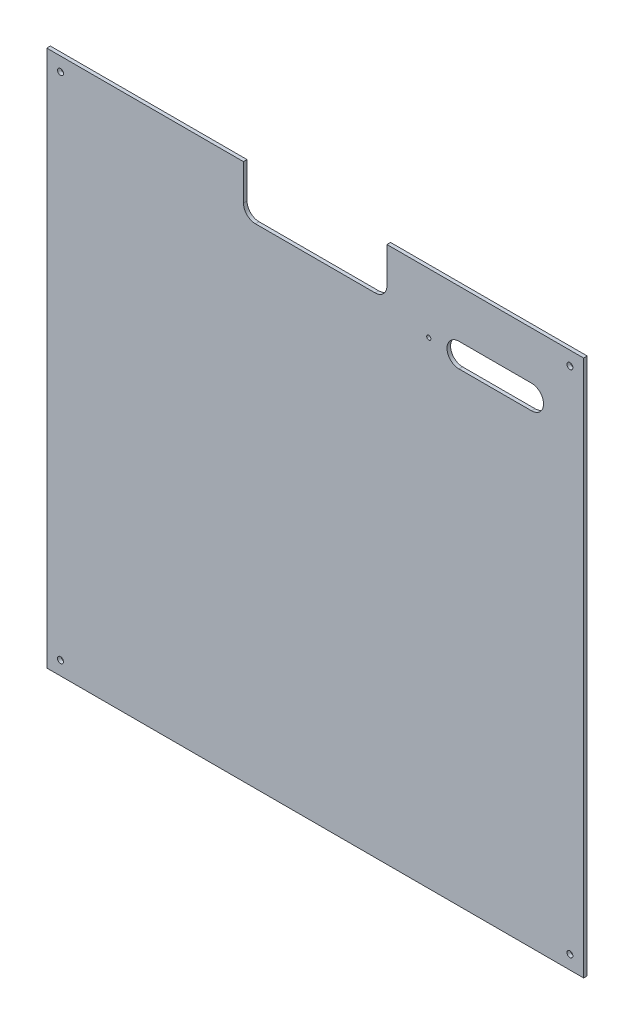
ISO-10303-21;
HEADER;
FILE_DESCRIPTION(('STEP AP214'),'2;1');
FILE_NAME('part.step','',(''),(''),'','','');
FILE_SCHEMA(('AUTOMOTIVE_DESIGN { 1 0 10303 214 1 1 1 1 }'));
ENDSEC;
DATA;
#1=APPLICATION_CONTEXT('core data for automotive mechanical design processes');
#2=APPLICATION_PROTOCOL_DEFINITION('international standard','automotive_design',2000,#1);
#3=PRODUCT_CONTEXT('',#1,'mechanical');
#4=PRODUCT('Part','Part','',(#3));
#5=PRODUCT_RELATED_PRODUCT_CATEGORY('part','',(#4));
#6=PRODUCT_DEFINITION_FORMATION('','',#4);
#7=PRODUCT_DEFINITION_CONTEXT('part definition',#1,'design');
#8=PRODUCT_DEFINITION('design','',#6,#7);
#9=PRODUCT_DEFINITION_SHAPE('','',#8);
#10=(LENGTH_UNIT() NAMED_UNIT(*) SI_UNIT(.MILLI.,.METRE.));
#11=(NAMED_UNIT(*) PLANE_ANGLE_UNIT() SI_UNIT($,.RADIAN.));
#12=(NAMED_UNIT(*) SI_UNIT($,.STERADIAN.) SOLID_ANGLE_UNIT());
#13=UNCERTAINTY_MEASURE_WITH_UNIT(LENGTH_MEASURE(1.E-05),#10,'distance_accuracy_value','');
#14=(GEOMETRIC_REPRESENTATION_CONTEXT(3) GLOBAL_UNCERTAINTY_ASSIGNED_CONTEXT((#13)) GLOBAL_UNIT_ASSIGNED_CONTEXT((#10,
#11,#12)) REPRESENTATION_CONTEXT('',''));
#15=CARTESIAN_POINT('',(0.,0.,0.));
#16=DIRECTION('',(0.,0.,1.));
#17=DIRECTION('',(1.,0.,0.));
#18=AXIS2_PLACEMENT_3D('',#15,#16,#17);
#19=CARTESIAN_POINT('',(174.5,419.,3.));
#20=DIRECTION('',(0.,0.,1.));
#21=DIRECTION('',(1.,0.,0.));
#22=AXIS2_PLACEMENT_3D('',#19,#20,#21);
#23=PLANE('',#22);
#24=DIRECTION('',(1.,0.,0.));
#25=VECTOR('',#24,1.);
#26=CARTESIAN_POINT('',(344.715899344631,389.,3.));
#27=LINE('',#26,#25);
#28=CARTESIAN_POINT('',(344.715899344631,389.,3.));
#29=VERTEX_POINT('',#28);
#30=CARTESIAN_POINT('',(405.440355678252,389.,3.));
#31=VERTEX_POINT('',#30);
#32=EDGE_CURVE('E144',#29,#31,#27,.T.);
#33=ORIENTED_EDGE('',*,*,#32,.F.);
#34=CARTESIAN_POINT('',(344.715899344631,399.,3.));
#35=DIRECTION('',(0.,0.,1.));
#36=DIRECTION('',(1.,0.,0.));
#37=AXIS2_PLACEMENT_3D('',#34,#35,#36);
#38=CIRCLE('',#37,10.);
#39=CARTESIAN_POINT('',(344.715899344631,409.,3.));
#40=VERTEX_POINT('',#39);
#41=EDGE_CURVE('E136',#40,#29,#38,.T.);
#42=ORIENTED_EDGE('',*,*,#41,.F.);
#43=DIRECTION('',(-1.,0.,0.));
#44=VECTOR('',#43,1.);
#45=CARTESIAN_POINT('',(344.715899344631,409.,3.));
#46=LINE('',#45,#44);
#47=CARTESIAN_POINT('',(405.440355678252,409.,3.));
#48=VERTEX_POINT('',#47);
#49=EDGE_CURVE('E159',#48,#40,#46,.T.);
#50=ORIENTED_EDGE('',*,*,#49,.F.);
#51=CARTESIAN_POINT('',(405.440355678252,399.,3.));
#52=DIRECTION('',(0.,0.,1.));
#53=DIRECTION('',(1.,0.,0.));
#54=AXIS2_PLACEMENT_3D('',#51,#52,#53);
#55=CIRCLE('',#54,10.);
#56=EDGE_CURVE('E157',#31,#48,#55,.T.);
#57=ORIENTED_EDGE('',*,*,#56,.F.);
#58=EDGE_LOOP('',(#33,#42,#50,#57));
#59=FACE_BOUND('',#58,.T.);
#60=CARTESIAN_POINT('',(11.5,437.5,3.));
#61=DIRECTION('',(0.,0.,1.));
#62=DIRECTION('',(-1.,0.,0.));
#63=AXIS2_PLACEMENT_3D('',#60,#61,#62);
#64=CIRCLE('',#63,2.5);
#65=CARTESIAN_POINT('',(9.,437.5,3.));
#66=VERTEX_POINT('',#65);
#67=EDGE_CURVE('E175',#66,#66,#64,.T.);
#68=ORIENTED_EDGE('',*,*,#67,.F.);
#69=EDGE_LOOP('',(#68));
#70=FACE_BOUND('',#69,.T.);
#71=CARTESIAN_POINT('',(437.5,11.5,3.));
#72=DIRECTION('',(0.,0.,1.));
#73=DIRECTION('',(-1.,0.,0.));
#74=AXIS2_PLACEMENT_3D('',#71,#72,#73);
#75=CIRCLE('',#74,2.49999999999997);
#76=CARTESIAN_POINT('',(435.,11.5,3.));
#77=VERTEX_POINT('',#76);
#78=EDGE_CURVE('E187',#77,#77,#75,.T.);
#79=ORIENTED_EDGE('',*,*,#78,.F.);
#80=EDGE_LOOP('',(#79));
#81=FACE_BOUND('',#80,.T.);
#82=DIRECTION('',(1.,0.,0.));
#83=VECTOR('',#82,1.);
#84=CARTESIAN_POINT('',(449.,0.,3.));
#85=LINE('',#84,#83);
#86=CARTESIAN_POINT('',(0.,0.,3.));
#87=VERTEX_POINT('',#86);
#88=CARTESIAN_POINT('',(449.,0.,3.));
#89=VERTEX_POINT('',#88);
#90=EDGE_CURVE('E199',#87,#89,#85,.T.);
#91=ORIENTED_EDGE('',*,*,#90,.T.);
#92=DIRECTION('',(0.,1.,0.));
#93=VECTOR('',#92,1.);
#94=CARTESIAN_POINT('',(449.,449.,3.));
#95=LINE('',#94,#93);
#96=CARTESIAN_POINT('',(449.,449.,3.));
#97=VERTEX_POINT('',#96);
#98=EDGE_CURVE('E202',#89,#97,#95,.T.);
#99=ORIENTED_EDGE('',*,*,#98,.T.);
#100=DIRECTION('',(-1.,0.,0.));
#101=VECTOR('',#100,1.);
#102=CARTESIAN_POINT('',(284.5,449.,3.));
#103=LINE('',#102,#101);
#104=CARTESIAN_POINT('',(284.5,449.,3.));
#105=VERTEX_POINT('',#104);
#106=EDGE_CURVE('E205',#97,#105,#103,.T.);
#107=ORIENTED_EDGE('',*,*,#106,.T.);
#108=DIRECTION('',(0.,-1.,0.));
#109=VECTOR('',#108,1.);
#110=CARTESIAN_POINT('',(284.5,419.,3.));
#111=LINE('',#110,#109);
#112=CARTESIAN_POINT('',(284.5,419.,3.));
#113=VERTEX_POINT('',#112);
#114=EDGE_CURVE('E207',#105,#113,#111,.T.);
#115=ORIENTED_EDGE('',*,*,#114,.T.);
#116=CARTESIAN_POINT('',(274.5,419.,3.));
#117=DIRECTION('',(0.,0.,-1.));
#118=DIRECTION('',(-1.,0.,0.));
#119=AXIS2_PLACEMENT_3D('',#116,#117,#118);
#120=CIRCLE('',#119,10.);
#121=CARTESIAN_POINT('',(274.5,409.,3.));
#122=VERTEX_POINT('',#121);
#123=EDGE_CURVE('E209',#113,#122,#120,.T.);
#124=ORIENTED_EDGE('',*,*,#123,.T.);
#125=DIRECTION('',(-1.,0.,0.));
#126=VECTOR('',#125,1.);
#127=CARTESIAN_POINT('',(174.5,409.,3.));
#128=LINE('',#127,#126);
#129=CARTESIAN_POINT('',(174.5,409.,3.));
#130=VERTEX_POINT('',#129);
#131=EDGE_CURVE('E211',#122,#130,#128,.T.);
#132=ORIENTED_EDGE('',*,*,#131,.T.);
#133=CARTESIAN_POINT('',(174.5,419.,3.));
#134=DIRECTION('',(0.,0.,-1.));
#135=DIRECTION('',(1.,0.,0.));
#136=AXIS2_PLACEMENT_3D('',#133,#134,#135);
#137=CIRCLE('',#136,10.);
#138=CARTESIAN_POINT('',(164.5,419.,3.));
#139=VERTEX_POINT('',#138);
#140=EDGE_CURVE('E213',#130,#139,#137,.T.);
#141=ORIENTED_EDGE('',*,*,#140,.T.);
#142=DIRECTION('',(0.,1.,0.));
#143=VECTOR('',#142,1.);
#144=CARTESIAN_POINT('',(164.5,449.,3.));
#145=LINE('',#144,#143);
#146=CARTESIAN_POINT('',(164.5,449.,3.));
#147=VERTEX_POINT('',#146);
#148=EDGE_CURVE('E215',#139,#147,#145,.T.);
#149=ORIENTED_EDGE('',*,*,#148,.T.);
#150=DIRECTION('',(-1.,0.,0.));
#151=VECTOR('',#150,1.);
#152=CARTESIAN_POINT('',(0.,449.,3.));
#153=LINE('',#152,#151);
#154=CARTESIAN_POINT('',(0.,449.,3.));
#155=VERTEX_POINT('',#154);
#156=EDGE_CURVE('E217',#147,#155,#153,.T.);
#157=ORIENTED_EDGE('',*,*,#156,.T.);
#158=DIRECTION('',(0.,-1.,0.));
#159=VECTOR('',#158,1.);
#160=CARTESIAN_POINT('',(0.,0.,3.));
#161=LINE('',#160,#159);
#162=EDGE_CURVE('E219',#155,#87,#161,.T.);
#163=ORIENTED_EDGE('',*,*,#162,.T.);
#164=EDGE_LOOP('',(#91,#99,#107,#115,#124,#132,#141,#149,#157,#163));
#165=FACE_BOUND('',#164,.T.);
#166=CARTESIAN_POINT('',(11.5,11.5,3.));
#167=DIRECTION('',(0.,0.,1.));
#168=DIRECTION('',(1.,0.,0.));
#169=AXIS2_PLACEMENT_3D('',#166,#167,#168);
#170=CIRCLE('',#169,2.5);
#171=CARTESIAN_POINT('',(14.,11.5,3.));
#172=VERTEX_POINT('',#171);
#173=EDGE_CURVE('E193',#172,#172,#170,.T.);
#174=ORIENTED_EDGE('',*,*,#173,.F.);
#175=EDGE_LOOP('',(#174));
#176=FACE_BOUND('',#175,.T.);
#177=CARTESIAN_POINT('',(437.5,437.5,3.));
#178=DIRECTION('',(0.,0.,1.));
#179=DIRECTION('',(1.,0.,0.));
#180=AXIS2_PLACEMENT_3D('',#177,#178,#179);
#181=CIRCLE('',#180,2.49999999999997);
#182=CARTESIAN_POINT('',(440.,437.5,3.));
#183=VERTEX_POINT('',#182);
#184=EDGE_CURVE('E181',#183,#183,#181,.T.);
#185=ORIENTED_EDGE('',*,*,#184,.F.);
#186=EDGE_LOOP('',(#185));
#187=FACE_BOUND('',#186,.T.);
#188=CARTESIAN_POINT('',(319.5,399.,3.));
#189=DIRECTION('',(0.,0.,1.));
#190=DIRECTION('',(1.,0.,0.));
#191=AXIS2_PLACEMENT_3D('',#188,#189,#190);
#192=CIRCLE('',#191,1.74999999999998);
#193=CARTESIAN_POINT('',(321.25,399.,3.));
#194=VERTEX_POINT('',#193);
#195=EDGE_CURVE('E165',#194,#194,#192,.T.);
#196=ORIENTED_EDGE('',*,*,#195,.F.);
#197=EDGE_LOOP('',(#196));
#198=FACE_BOUND('',#197,.T.);
#199=ADVANCED_FACE('F35',(#59,#70,#81,#165,#176,#187,#198),#23,.T.);
#200=CARTESIAN_POINT('',(174.5,419.,0.));
#201=DIRECTION('',(0.,0.,1.));
#202=DIRECTION('',(1.,0.,0.));
#203=AXIS2_PLACEMENT_3D('',#200,#201,#202);
#204=PLANE('',#203);
#205=CARTESIAN_POINT('',(11.5,437.5,0.));
#206=DIRECTION('',(0.,0.,1.));
#207=DIRECTION('',(-1.,0.,0.));
#208=AXIS2_PLACEMENT_3D('',#205,#206,#207);
#209=CIRCLE('',#208,2.5);
#210=CARTESIAN_POINT('',(9.,437.5,0.));
#211=VERTEX_POINT('',#210);
#212=EDGE_CURVE('E152',#211,#211,#209,.T.);
#213=ORIENTED_EDGE('',*,*,#212,.T.);
#214=EDGE_LOOP('',(#213));
#215=FACE_BOUND('',#214,.T.);
#216=CARTESIAN_POINT('',(437.5,437.5,0.));
#217=DIRECTION('',(0.,0.,1.));
#218=DIRECTION('',(1.,0.,0.));
#219=AXIS2_PLACEMENT_3D('',#216,#217,#218);
#220=CIRCLE('',#219,2.49999999999997);
#221=CARTESIAN_POINT('',(440.,437.5,0.));
#222=VERTEX_POINT('',#221);
#223=EDGE_CURVE('E178',#222,#222,#220,.T.);
#224=ORIENTED_EDGE('',*,*,#223,.T.);
#225=EDGE_LOOP('',(#224));
#226=FACE_BOUND('',#225,.T.);
#227=CARTESIAN_POINT('',(437.5,11.5,0.));
#228=DIRECTION('',(0.,0.,1.));
#229=DIRECTION('',(-1.,0.,0.));
#230=AXIS2_PLACEMENT_3D('',#227,#228,#229);
#231=CIRCLE('',#230,2.49999999999997);
#232=CARTESIAN_POINT('',(435.,11.5,0.));
#233=VERTEX_POINT('',#232);
#234=EDGE_CURVE('E184',#233,#233,#231,.T.);
#235=ORIENTED_EDGE('',*,*,#234,.T.);
#236=EDGE_LOOP('',(#235));
#237=FACE_BOUND('',#236,.T.);
#238=CARTESIAN_POINT('',(11.5,11.5,0.));
#239=DIRECTION('',(0.,0.,1.));
#240=DIRECTION('',(1.,0.,0.));
#241=AXIS2_PLACEMENT_3D('',#238,#239,#240);
#242=CIRCLE('',#241,2.5);
#243=CARTESIAN_POINT('',(14.,11.5,0.));
#244=VERTEX_POINT('',#243);
#245=EDGE_CURVE('E190',#244,#244,#242,.T.);
#246=ORIENTED_EDGE('',*,*,#245,.T.);
#247=EDGE_LOOP('',(#246));
#248=FACE_BOUND('',#247,.T.);
#249=DIRECTION('',(1.,0.,0.));
#250=VECTOR('',#249,1.);
#251=CARTESIAN_POINT('',(449.,0.,0.));
#252=LINE('',#251,#250);
#253=CARTESIAN_POINT('',(0.,0.,0.));
#254=VERTEX_POINT('',#253);
#255=CARTESIAN_POINT('',(449.,0.,0.));
#256=VERTEX_POINT('',#255);
#257=EDGE_CURVE('E196',#254,#256,#252,.T.);
#258=ORIENTED_EDGE('',*,*,#257,.F.);
#259=DIRECTION('',(0.,-1.,0.));
#260=VECTOR('',#259,1.);
#261=CARTESIAN_POINT('',(0.,0.,0.));
#262=LINE('',#261,#260);
#263=CARTESIAN_POINT('',(0.,449.,0.));
#264=VERTEX_POINT('',#263);
#265=EDGE_CURVE('E203',#264,#254,#262,.T.);
#266=ORIENTED_EDGE('',*,*,#265,.F.);
#267=DIRECTION('',(-1.,0.,0.));
#268=VECTOR('',#267,1.);
#269=CARTESIAN_POINT('',(0.,449.,0.));
#270=LINE('',#269,#268);
#271=CARTESIAN_POINT('',(164.5,449.,0.));
#272=VERTEX_POINT('',#271);
#273=EDGE_CURVE('E238',#272,#264,#270,.T.);
#274=ORIENTED_EDGE('',*,*,#273,.F.);
#275=DIRECTION('',(0.,1.,0.));
#276=VECTOR('',#275,1.);
#277=CARTESIAN_POINT('',(164.5,449.,0.));
#278=LINE('',#277,#276);
#279=CARTESIAN_POINT('',(164.5,419.,0.));
#280=VERTEX_POINT('',#279);
#281=EDGE_CURVE('E236',#280,#272,#278,.T.);
#282=ORIENTED_EDGE('',*,*,#281,.F.);
#283=CARTESIAN_POINT('',(174.5,419.,0.));
#284=DIRECTION('',(0.,0.,-1.));
#285=DIRECTION('',(1.,0.,0.));
#286=AXIS2_PLACEMENT_3D('',#283,#284,#285);
#287=CIRCLE('',#286,10.);
#288=CARTESIAN_POINT('',(174.5,409.,0.));
#289=VERTEX_POINT('',#288);
#290=EDGE_CURVE('E234',#289,#280,#287,.T.);
#291=ORIENTED_EDGE('',*,*,#290,.F.);
#292=DIRECTION('',(-1.,0.,0.));
#293=VECTOR('',#292,1.);
#294=CARTESIAN_POINT('',(174.5,409.,0.));
#295=LINE('',#294,#293);
#296=CARTESIAN_POINT('',(274.5,409.,0.));
#297=VERTEX_POINT('',#296);
#298=EDGE_CURVE('E232',#297,#289,#295,.T.);
#299=ORIENTED_EDGE('',*,*,#298,.F.);
#300=CARTESIAN_POINT('',(274.5,419.,0.));
#301=DIRECTION('',(0.,0.,-1.));
#302=DIRECTION('',(-1.,0.,0.));
#303=AXIS2_PLACEMENT_3D('',#300,#301,#302);
#304=CIRCLE('',#303,10.);
#305=CARTESIAN_POINT('',(284.5,419.,0.));
#306=VERTEX_POINT('',#305);
#307=EDGE_CURVE('E230',#306,#297,#304,.T.);
#308=ORIENTED_EDGE('',*,*,#307,.F.);
#309=DIRECTION('',(0.,-1.,0.));
#310=VECTOR('',#309,1.);
#311=CARTESIAN_POINT('',(284.5,419.,0.));
#312=LINE('',#311,#310);
#313=CARTESIAN_POINT('',(284.5,449.,0.));
#314=VERTEX_POINT('',#313);
#315=EDGE_CURVE('E228',#314,#306,#312,.T.);
#316=ORIENTED_EDGE('',*,*,#315,.F.);
#317=DIRECTION('',(-1.,0.,0.));
#318=VECTOR('',#317,1.);
#319=CARTESIAN_POINT('',(284.5,449.,0.));
#320=LINE('',#319,#318);
#321=CARTESIAN_POINT('',(449.,449.,0.));
#322=VERTEX_POINT('',#321);
#323=EDGE_CURVE('E226',#322,#314,#320,.T.);
#324=ORIENTED_EDGE('',*,*,#323,.F.);
#325=DIRECTION('',(0.,1.,0.));
#326=VECTOR('',#325,1.);
#327=CARTESIAN_POINT('',(449.,449.,0.));
#328=LINE('',#327,#326);
#329=EDGE_CURVE('E224',#256,#322,#328,.T.);
#330=ORIENTED_EDGE('',*,*,#329,.F.);
#331=EDGE_LOOP('',(#258,#266,#274,#282,#291,#299,#308,#316,#324,#330));
#332=FACE_BOUND('',#331,.T.);
#333=CARTESIAN_POINT('',(344.715899344631,399.,0.));
#334=DIRECTION('',(0.,0.,1.));
#335=DIRECTION('',(1.,0.,0.));
#336=AXIS2_PLACEMENT_3D('',#333,#334,#335);
#337=CIRCLE('',#336,10.);
#338=CARTESIAN_POINT('',(344.715899344631,409.,0.));
#339=VERTEX_POINT('',#338);
#340=CARTESIAN_POINT('',(344.715899344631,389.,0.));
#341=VERTEX_POINT('',#340);
#342=EDGE_CURVE('E58',#339,#341,#337,.T.);
#343=ORIENTED_EDGE('',*,*,#342,.T.);
#344=DIRECTION('',(1.,0.,0.));
#345=VECTOR('',#344,1.);
#346=CARTESIAN_POINT('',(344.715899344631,389.,0.));
#347=LINE('',#346,#345);
#348=CARTESIAN_POINT('',(405.440355678252,389.,0.));
#349=VERTEX_POINT('',#348);
#350=EDGE_CURVE('E151',#341,#349,#347,.T.);
#351=ORIENTED_EDGE('',*,*,#350,.T.);
#352=CARTESIAN_POINT('',(405.440355678252,399.,0.));
#353=DIRECTION('',(0.,0.,1.));
#354=DIRECTION('',(1.,0.,0.));
#355=AXIS2_PLACEMENT_3D('',#352,#353,#354);
#356=CIRCLE('',#355,10.);
#357=CARTESIAN_POINT('',(405.440355678252,409.,0.));
#358=VERTEX_POINT('',#357);
#359=EDGE_CURVE('E167',#349,#358,#356,.T.);
#360=ORIENTED_EDGE('',*,*,#359,.T.);
#361=DIRECTION('',(-1.,0.,0.));
#362=VECTOR('',#361,1.);
#363=CARTESIAN_POINT('',(344.715899344631,409.,0.));
#364=LINE('',#363,#362);
#365=EDGE_CURVE('E145',#358,#339,#364,.T.);
#366=ORIENTED_EDGE('',*,*,#365,.T.);
#367=EDGE_LOOP('',(#343,#351,#360,#366));
#368=FACE_BOUND('',#367,.T.);
#369=CARTESIAN_POINT('',(319.5,399.,0.));
#370=DIRECTION('',(0.,0.,1.));
#371=DIRECTION('',(1.,0.,0.));
#372=AXIS2_PLACEMENT_3D('',#369,#370,#371);
#373=CIRCLE('',#372,1.74999999999998);
#374=CARTESIAN_POINT('',(321.25,399.,0.));
#375=VERTEX_POINT('',#374);
#376=EDGE_CURVE('E503',#375,#375,#373,.T.);
#377=ORIENTED_EDGE('',*,*,#376,.T.);
#378=EDGE_LOOP('',(#377));
#379=FACE_BOUND('',#378,.T.);
#380=ADVANCED_FACE('F274',(#215,#226,#237,#248,#332,#368,#379),#204,.F.);
#381=CARTESIAN_POINT('',(449.,0.,3.));
#382=DIRECTION('',(0.,1.,0.));
#383=DIRECTION('',(0.,0.,1.));
#384=AXIS2_PLACEMENT_3D('',#381,#382,#383);
#385=PLANE('',#384);
#386=ORIENTED_EDGE('',*,*,#257,.T.);
#387=DIRECTION('',(0.,0.,-1.));
#388=VECTOR('',#387,1.);
#389=CARTESIAN_POINT('',(449.,0.,3.));
#390=LINE('',#389,#388);
#391=EDGE_CURVE('E11',#89,#256,#390,.T.);
#392=ORIENTED_EDGE('',*,*,#391,.F.);
#393=ORIENTED_EDGE('',*,*,#90,.F.);
#394=DIRECTION('',(0.,0.,-1.));
#395=VECTOR('',#394,1.);
#396=CARTESIAN_POINT('',(0.,0.,3.));
#397=LINE('',#396,#395);
#398=EDGE_CURVE('E221',#87,#254,#397,.T.);
#399=ORIENTED_EDGE('',*,*,#398,.T.);
#400=EDGE_LOOP('',(#386,#392,#393,#399));
#401=FACE_BOUND('',#400,.T.);
#402=ADVANCED_FACE('F37',(#401),#385,.F.);
#403=CARTESIAN_POINT('',(449.,449.,3.));
#404=DIRECTION('',(-1.,0.,0.));
#405=DIRECTION('',(0.,-1.,0.));
#406=AXIS2_PLACEMENT_3D('',#403,#404,#405);
#407=PLANE('',#406);
#408=ORIENTED_EDGE('',*,*,#329,.T.);
#409=DIRECTION('',(0.,0.,-1.));
#410=VECTOR('',#409,1.);
#411=CARTESIAN_POINT('',(449.,449.,3.));
#412=LINE('',#411,#410);
#413=EDGE_CURVE('E43',#97,#322,#412,.T.);
#414=ORIENTED_EDGE('',*,*,#413,.F.);
#415=ORIENTED_EDGE('',*,*,#98,.F.);
#416=ORIENTED_EDGE('',*,*,#391,.T.);
#417=EDGE_LOOP('',(#408,#414,#415,#416));
#418=FACE_BOUND('',#417,.T.);
#419=ADVANCED_FACE('F292',(#418),#407,.F.);
#420=CARTESIAN_POINT('',(284.5,449.,3.));
#421=DIRECTION('',(0.,-1.,0.));
#422=DIRECTION('',(0.,0.,-1.));
#423=AXIS2_PLACEMENT_3D('',#420,#421,#422);
#424=PLANE('',#423);
#425=ORIENTED_EDGE('',*,*,#323,.T.);
#426=DIRECTION('',(0.,0.,-1.));
#427=VECTOR('',#426,1.);
#428=CARTESIAN_POINT('',(284.5,449.,3.));
#429=LINE('',#428,#427);
#430=EDGE_CURVE('E261',#105,#314,#429,.T.);
#431=ORIENTED_EDGE('',*,*,#430,.F.);
#432=ORIENTED_EDGE('',*,*,#106,.F.);
#433=ORIENTED_EDGE('',*,*,#413,.T.);
#434=EDGE_LOOP('',(#425,#431,#432,#433));
#435=FACE_BOUND('',#434,.T.);
#436=ADVANCED_FACE('F268',(#435),#424,.F.);
#437=CARTESIAN_POINT('',(284.5,419.,3.));
#438=DIRECTION('',(1.,0.,0.));
#439=DIRECTION('',(0.,0.,-1.));
#440=AXIS2_PLACEMENT_3D('',#437,#438,#439);
#441=PLANE('',#440);
#442=ORIENTED_EDGE('',*,*,#315,.T.);
#443=DIRECTION('',(0.,0.,-1.));
#444=VECTOR('',#443,1.);
#445=CARTESIAN_POINT('',(284.5,419.,3.));
#446=LINE('',#445,#444);
#447=EDGE_CURVE('E258',#113,#306,#446,.T.);
#448=ORIENTED_EDGE('',*,*,#447,.F.);
#449=ORIENTED_EDGE('',*,*,#114,.F.);
#450=ORIENTED_EDGE('',*,*,#430,.T.);
#451=EDGE_LOOP('',(#442,#448,#449,#450));
#452=FACE_BOUND('',#451,.T.);
#453=ADVANCED_FACE('F280',(#452),#441,.F.);
#454=CARTESIAN_POINT('',(274.5,419.,3.));
#455=DIRECTION('',(0.,0.,-1.));
#456=DIRECTION('',(-1.,0.,0.));
#457=AXIS2_PLACEMENT_3D('',#454,#455,#456);
#458=CYLINDRICAL_SURFACE('',#457,10.);
#459=ORIENTED_EDGE('',*,*,#307,.T.);
#460=DIRECTION('',(0.,0.,-1.));
#461=VECTOR('',#460,1.);
#462=CARTESIAN_POINT('',(274.5,409.,3.));
#463=LINE('',#462,#461);
#464=EDGE_CURVE('E255',#122,#297,#463,.T.);
#465=ORIENTED_EDGE('',*,*,#464,.F.);
#466=ORIENTED_EDGE('',*,*,#123,.F.);
#467=ORIENTED_EDGE('',*,*,#447,.T.);
#468=EDGE_LOOP('',(#459,#465,#466,#467));
#469=FACE_BOUND('',#468,.T.);
#470=ADVANCED_FACE('F284',(#469),#458,.F.);
#471=CARTESIAN_POINT('',(174.5,409.,3.));
#472=DIRECTION('',(0.,-1.,0.));
#473=DIRECTION('',(0.,0.,-1.));
#474=AXIS2_PLACEMENT_3D('',#471,#472,#473);
#475=PLANE('',#474);
#476=ORIENTED_EDGE('',*,*,#298,.T.);
#477=DIRECTION('',(0.,0.,-1.));
#478=VECTOR('',#477,1.);
#479=CARTESIAN_POINT('',(174.5,409.,3.));
#480=LINE('',#479,#478);
#481=EDGE_CURVE('E252',#130,#289,#480,.T.);
#482=ORIENTED_EDGE('',*,*,#481,.F.);
#483=ORIENTED_EDGE('',*,*,#131,.F.);
#484=ORIENTED_EDGE('',*,*,#464,.T.);
#485=EDGE_LOOP('',(#476,#482,#483,#484));
#486=FACE_BOUND('',#485,.T.);
#487=ADVANCED_FACE('F315',(#486),#475,.F.);
#488=CARTESIAN_POINT('',(174.5,419.,3.));
#489=DIRECTION('',(0.,0.,-1.));
#490=DIRECTION('',(-1.,0.,0.));
#491=AXIS2_PLACEMENT_3D('',#488,#489,#490);
#492=CYLINDRICAL_SURFACE('',#491,10.);
#493=ORIENTED_EDGE('',*,*,#290,.T.);
#494=DIRECTION('',(0.,0.,-1.));
#495=VECTOR('',#494,1.);
#496=CARTESIAN_POINT('',(164.5,419.,3.));
#497=LINE('',#496,#495);
#498=EDGE_CURVE('E249',#139,#280,#497,.T.);
#499=ORIENTED_EDGE('',*,*,#498,.F.);
#500=ORIENTED_EDGE('',*,*,#140,.F.);
#501=ORIENTED_EDGE('',*,*,#481,.T.);
#502=EDGE_LOOP('',(#493,#499,#500,#501));
#503=FACE_BOUND('',#502,.T.);
#504=ADVANCED_FACE('F312',(#503),#492,.F.);
#505=CARTESIAN_POINT('',(164.5,449.,3.));
#506=DIRECTION('',(-1.,0.,0.));
#507=DIRECTION('',(0.,0.,1.));
#508=AXIS2_PLACEMENT_3D('',#505,#506,#507);
#509=PLANE('',#508);
#510=ORIENTED_EDGE('',*,*,#281,.T.);
#511=DIRECTION('',(0.,0.,-1.));
#512=VECTOR('',#511,1.);
#513=CARTESIAN_POINT('',(164.5,449.,3.));
#514=LINE('',#513,#512);
#515=EDGE_CURVE('E246',#147,#272,#514,.T.);
#516=ORIENTED_EDGE('',*,*,#515,.F.);
#517=ORIENTED_EDGE('',*,*,#148,.F.);
#518=ORIENTED_EDGE('',*,*,#498,.T.);
#519=EDGE_LOOP('',(#510,#516,#517,#518));
#520=FACE_BOUND('',#519,.T.);
#521=ADVANCED_FACE('F308',(#520),#509,.F.);
#522=CARTESIAN_POINT('',(0.,449.,3.));
#523=DIRECTION('',(0.,-1.,0.));
#524=DIRECTION('',(0.,0.,-1.));
#525=AXIS2_PLACEMENT_3D('',#522,#523,#524);
#526=PLANE('',#525);
#527=ORIENTED_EDGE('',*,*,#273,.T.);
#528=DIRECTION('',(0.,0.,-1.));
#529=VECTOR('',#528,1.);
#530=CARTESIAN_POINT('',(0.,449.,3.));
#531=LINE('',#530,#529);
#532=EDGE_CURVE('E243',#155,#264,#531,.T.);
#533=ORIENTED_EDGE('',*,*,#532,.F.);
#534=ORIENTED_EDGE('',*,*,#156,.F.);
#535=ORIENTED_EDGE('',*,*,#515,.T.);
#536=EDGE_LOOP('',(#527,#533,#534,#535));
#537=FACE_BOUND('',#536,.T.);
#538=ADVANCED_FACE('F304',(#537),#526,.F.);
#539=CARTESIAN_POINT('',(0.,0.,3.));
#540=DIRECTION('',(1.,0.,0.));
#541=DIRECTION('',(0.,0.,-1.));
#542=AXIS2_PLACEMENT_3D('',#539,#540,#541);
#543=PLANE('',#542);
#544=ORIENTED_EDGE('',*,*,#265,.T.);
#545=ORIENTED_EDGE('',*,*,#398,.F.);
#546=ORIENTED_EDGE('',*,*,#162,.F.);
#547=ORIENTED_EDGE('',*,*,#532,.T.);
#548=EDGE_LOOP('',(#544,#545,#546,#547));
#549=FACE_BOUND('',#548,.T.);
#550=ADVANCED_FACE('F299',(#549),#543,.F.);
#551=CARTESIAN_POINT('',(11.5,11.5,3.));
#552=DIRECTION('',(0.,0.,-1.));
#553=DIRECTION('',(-1.,0.,0.));
#554=AXIS2_PLACEMENT_3D('',#551,#552,#553);
#555=CYLINDRICAL_SURFACE('',#554,2.5);
#556=ORIENTED_EDGE('',*,*,#173,.T.);
#557=EDGE_LOOP('',(#556));
#558=FACE_BOUND('',#557,.T.);
#559=ORIENTED_EDGE('',*,*,#245,.F.);
#560=EDGE_LOOP('',(#559));
#561=FACE_BOUND('',#560,.T.);
#562=ADVANCED_FACE('F332',(#558,#561),#555,.F.);
#563=CARTESIAN_POINT('',(437.5,11.5,3.));
#564=DIRECTION('',(0.,0.,-1.));
#565=DIRECTION('',(-1.,0.,0.));
#566=AXIS2_PLACEMENT_3D('',#563,#564,#565);
#567=CYLINDRICAL_SURFACE('',#566,2.49999999999997);
#568=ORIENTED_EDGE('',*,*,#78,.T.);
#569=EDGE_LOOP('',(#568));
#570=FACE_BOUND('',#569,.T.);
#571=ORIENTED_EDGE('',*,*,#234,.F.);
#572=EDGE_LOOP('',(#571));
#573=FACE_BOUND('',#572,.T.);
#574=ADVANCED_FACE('F358',(#570,#573),#567,.F.);
#575=CARTESIAN_POINT('',(437.5,437.5,3.));
#576=DIRECTION('',(0.,0.,-1.));
#577=DIRECTION('',(-1.,0.,0.));
#578=AXIS2_PLACEMENT_3D('',#575,#576,#577);
#579=CYLINDRICAL_SURFACE('',#578,2.49999999999997);
#580=ORIENTED_EDGE('',*,*,#184,.T.);
#581=EDGE_LOOP('',(#580));
#582=FACE_BOUND('',#581,.T.);
#583=ORIENTED_EDGE('',*,*,#223,.F.);
#584=EDGE_LOOP('',(#583));
#585=FACE_BOUND('',#584,.T.);
#586=ADVANCED_FACE('F365',(#582,#585),#579,.F.);
#587=CARTESIAN_POINT('',(11.5,437.5,3.));
#588=DIRECTION('',(0.,0.,-1.));
#589=DIRECTION('',(-1.,0.,0.));
#590=AXIS2_PLACEMENT_3D('',#587,#588,#589);
#591=CYLINDRICAL_SURFACE('',#590,2.5);
#592=ORIENTED_EDGE('',*,*,#67,.T.);
#593=EDGE_LOOP('',(#592));
#594=FACE_BOUND('',#593,.T.);
#595=ORIENTED_EDGE('',*,*,#212,.F.);
#596=EDGE_LOOP('',(#595));
#597=FACE_BOUND('',#596,.T.);
#598=ADVANCED_FACE('F372',(#594,#597),#591,.F.);
#599=CARTESIAN_POINT('',(344.715899344631,399.,3.));
#600=DIRECTION('',(0.,0.,-1.));
#601=DIRECTION('',(-1.,0.,0.));
#602=AXIS2_PLACEMENT_3D('',#599,#600,#601);
#603=CYLINDRICAL_SURFACE('',#602,10.);
#604=ORIENTED_EDGE('',*,*,#342,.F.);
#605=DIRECTION('',(0.,0.,-1.));
#606=VECTOR('',#605,1.);
#607=CARTESIAN_POINT('',(344.715899344631,409.,3.));
#608=LINE('',#607,#606);
#609=EDGE_CURVE('E140',#40,#339,#608,.T.);
#610=ORIENTED_EDGE('',*,*,#609,.F.);
#611=ORIENTED_EDGE('',*,*,#41,.T.);
#612=DIRECTION('',(0.,0.,-1.));
#613=VECTOR('',#612,1.);
#614=CARTESIAN_POINT('',(344.715899344631,389.,3.));
#615=LINE('',#614,#613);
#616=EDGE_CURVE('E139',#29,#341,#615,.T.);
#617=ORIENTED_EDGE('',*,*,#616,.T.);
#618=EDGE_LOOP('',(#604,#610,#611,#617));
#619=FACE_BOUND('',#618,.T.);
#620=ADVANCED_FACE('F138',(#619),#603,.F.);
#621=CARTESIAN_POINT('',(344.715899344631,389.,3.));
#622=DIRECTION('',(0.,1.,0.));
#623=DIRECTION('',(0.,0.,1.));
#624=AXIS2_PLACEMENT_3D('',#621,#622,#623);
#625=PLANE('',#624);
#626=ORIENTED_EDGE('',*,*,#350,.F.);
#627=ORIENTED_EDGE('',*,*,#616,.F.);
#628=ORIENTED_EDGE('',*,*,#32,.T.);
#629=DIRECTION('',(0.,0.,-1.));
#630=VECTOR('',#629,1.);
#631=CARTESIAN_POINT('',(405.440355678252,389.,3.));
#632=LINE('',#631,#630);
#633=EDGE_CURVE('E153',#31,#349,#632,.T.);
#634=ORIENTED_EDGE('',*,*,#633,.T.);
#635=EDGE_LOOP('',(#626,#627,#628,#634));
#636=FACE_BOUND('',#635,.T.);
#637=ADVANCED_FACE('F148',(#636),#625,.T.);
#638=CARTESIAN_POINT('',(405.440355678252,399.,3.));
#639=DIRECTION('',(0.,0.,-1.));
#640=DIRECTION('',(-1.,0.,0.));
#641=AXIS2_PLACEMENT_3D('',#638,#639,#640);
#642=CYLINDRICAL_SURFACE('',#641,10.);
#643=ORIENTED_EDGE('',*,*,#359,.F.);
#644=ORIENTED_EDGE('',*,*,#633,.F.);
#645=ORIENTED_EDGE('',*,*,#56,.T.);
#646=DIRECTION('',(0.,0.,-1.));
#647=VECTOR('',#646,1.);
#648=CARTESIAN_POINT('',(405.440355678252,409.,3.));
#649=LINE('',#648,#647);
#650=EDGE_CURVE('E50',#48,#358,#649,.T.);
#651=ORIENTED_EDGE('',*,*,#650,.T.);
#652=EDGE_LOOP('',(#643,#644,#645,#651));
#653=FACE_BOUND('',#652,.T.);
#654=ADVANCED_FACE('F393',(#653),#642,.F.);
#655=CARTESIAN_POINT('',(344.715899344631,409.,3.));
#656=DIRECTION('',(0.,-1.,0.));
#657=DIRECTION('',(0.,0.,-1.));
#658=AXIS2_PLACEMENT_3D('',#655,#656,#657);
#659=PLANE('',#658);
#660=ORIENTED_EDGE('',*,*,#365,.F.);
#661=ORIENTED_EDGE('',*,*,#650,.F.);
#662=ORIENTED_EDGE('',*,*,#49,.T.);
#663=ORIENTED_EDGE('',*,*,#609,.T.);
#664=EDGE_LOOP('',(#660,#661,#662,#663));
#665=FACE_BOUND('',#664,.T.);
#666=ADVANCED_FACE('F400',(#665),#659,.T.);
#667=CARTESIAN_POINT('',(319.5,399.,3.));
#668=DIRECTION('',(0.,0.,-1.));
#669=DIRECTION('',(-1.,0.,0.));
#670=AXIS2_PLACEMENT_3D('',#667,#668,#669);
#671=CYLINDRICAL_SURFACE('',#670,1.74999999999998);
#672=ORIENTED_EDGE('',*,*,#195,.T.);
#673=EDGE_LOOP('',(#672));
#674=FACE_BOUND('',#673,.T.);
#675=ORIENTED_EDGE('',*,*,#376,.F.);
#676=EDGE_LOOP('',(#675));
#677=FACE_BOUND('',#676,.T.);
#678=ADVANCED_FACE('F408',(#674,#677),#671,.F.);
#679=CLOSED_SHELL('',(#199,#380,#402,#419,#436,#453,#470,#487,#504,#521,#538,#550,#562,#574,
#586,#598,#620,#637,#654,#666,#678));
#680=MANIFOLD_SOLID_BREP('B2',#679);
#681=ADVANCED_BREP_SHAPE_REPRESENTATION('',(#18,#680),#14);
#682=SHAPE_DEFINITION_REPRESENTATION(#9,#681);
ENDSEC;
END-ISO-10303-21;
